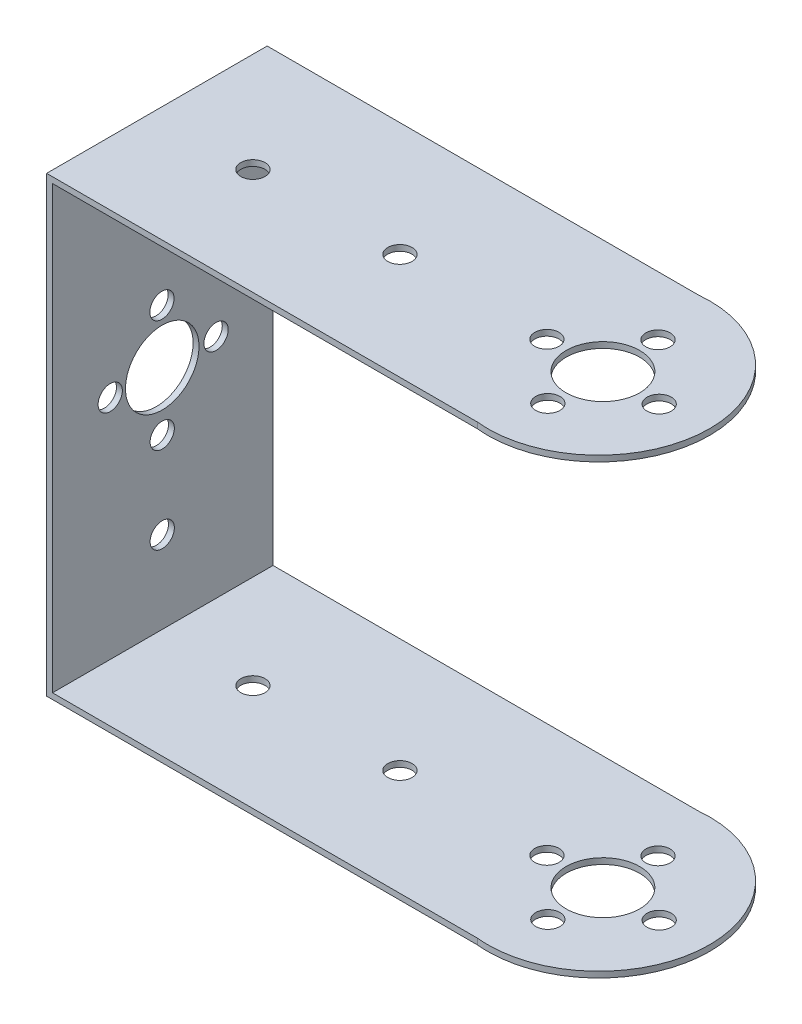
ISO-10303-21;
HEADER;
FILE_DESCRIPTION(('STEP AP214'),'2;1');
FILE_NAME('part.step','',(''),(''),'','','');
FILE_SCHEMA(('AUTOMOTIVE_DESIGN { 1 0 10303 214 1 1 1 1 }'));
ENDSEC;
DATA;
#1=APPLICATION_CONTEXT('core data for automotive mechanical design processes');
#2=APPLICATION_PROTOCOL_DEFINITION('international standard','automotive_design',2000,#1);
#3=PRODUCT_CONTEXT('',#1,'mechanical');
#4=PRODUCT('Part','Part','',(#3));
#5=PRODUCT_RELATED_PRODUCT_CATEGORY('part','',(#4));
#6=PRODUCT_DEFINITION_FORMATION('','',#4);
#7=PRODUCT_DEFINITION_CONTEXT('part definition',#1,'design');
#8=PRODUCT_DEFINITION('design','',#6,#7);
#9=PRODUCT_DEFINITION_SHAPE('','',#8);
#10=(LENGTH_UNIT() NAMED_UNIT(*) SI_UNIT(.MILLI.,.METRE.));
#11=(NAMED_UNIT(*) PLANE_ANGLE_UNIT() SI_UNIT($,.RADIAN.));
#12=(NAMED_UNIT(*) SI_UNIT($,.STERADIAN.) SOLID_ANGLE_UNIT());
#13=UNCERTAINTY_MEASURE_WITH_UNIT(LENGTH_MEASURE(1.E-05),#10,'distance_accuracy_value','');
#14=(GEOMETRIC_REPRESENTATION_CONTEXT(3) GLOBAL_UNCERTAINTY_ASSIGNED_CONTEXT((#13)) GLOBAL_UNIT_ASSIGNED_CONTEXT((#10,
#11,#12)) REPRESENTATION_CONTEXT('',''));
#15=CARTESIAN_POINT('',(0.,0.,0.));
#16=DIRECTION('',(0.,0.,1.));
#17=DIRECTION('',(1.,0.,0.));
#18=AXIS2_PLACEMENT_3D('',#15,#16,#17);
#19=CARTESIAN_POINT('',(0.,0.,0.));
#20=DIRECTION('',(0.,1.,0.));
#21=DIRECTION('',(0.,0.,1.));
#22=AXIS2_PLACEMENT_3D('',#19,#20,#21);
#23=PLANE('',#22);
#24=CARTESIAN_POINT('',(-25.9201944732818,0.,19.3373056041218));
#25=DIRECTION('',(0.,-1.,0.));
#26=DIRECTION('',(0.,0.,-1.));
#27=AXIS2_PLACEMENT_3D('',#24,#25,#26);
#28=CIRCLE('',#27,1.65);
#29=CARTESIAN_POINT('',(-25.9201944732818,0.,17.6873056041218));
#30=VERTEX_POINT('',#29);
#31=EDGE_CURVE('E145',#30,#30,#28,.T.);
#32=ORIENTED_EDGE('',*,*,#31,.F.);
#33=EDGE_LOOP('',(#32));
#34=FACE_BOUND('',#33,.T.);
#35=CARTESIAN_POINT('',(-5.92019447328184,0.,19.3373056041218));
#36=DIRECTION('',(0.,-1.,0.));
#37=DIRECTION('',(0.,0.,-1.));
#38=AXIS2_PLACEMENT_3D('',#35,#36,#37);
#39=CIRCLE('',#38,1.65);
#40=CARTESIAN_POINT('',(-5.92019447328184,0.,17.6873056041218));
#41=VERTEX_POINT('',#40);
#42=EDGE_CURVE('E151',#41,#41,#39,.T.);
#43=ORIENTED_EDGE('',*,*,#42,.F.);
#44=EDGE_LOOP('',(#43));
#45=FACE_BOUND('',#44,.T.);
#46=CARTESIAN_POINT('',(21.6943406418652,0.,26.8270363762988));
#47=DIRECTION('',(0.,-1.,0.));
#48=DIRECTION('',(0.,0.,-1.));
#49=AXIS2_PLACEMENT_3D('',#46,#47,#48);
#50=CIRCLE('',#49,1.65);
#51=CARTESIAN_POINT('',(21.6943406418652,0.,25.1770363762988));
#52=VERTEX_POINT('',#51);
#53=EDGE_CURVE('E204',#52,#52,#50,.T.);
#54=ORIENTED_EDGE('',*,*,#53,.F.);
#55=EDGE_LOOP('',(#54));
#56=FACE_BOUND('',#55,.T.);
#57=CARTESIAN_POINT('',(29.3496448643991,0.,19.3373056041218));
#58=DIRECTION('',(0.,-1.,0.));
#59=DIRECTION('',(0.,0.,-1.));
#60=AXIS2_PLACEMENT_3D('',#57,#58,#59);
#61=CIRCLE('',#60,1.65);
#62=CARTESIAN_POINT('',(29.3496448643991,0.,17.6873056041218));
#63=VERTEX_POINT('',#62);
#64=EDGE_CURVE('E200',#63,#63,#61,.T.);
#65=ORIENTED_EDGE('',*,*,#64,.F.);
#66=EDGE_LOOP('',(#65));
#67=FACE_BOUND('',#66,.T.);
#68=CARTESIAN_POINT('',(21.6943406418652,0.,11.8412506024772));
#69=DIRECTION('',(0.,-1.,0.));
#70=DIRECTION('',(0.,0.,-1.));
#71=AXIS2_PLACEMENT_3D('',#68,#69,#70);
#72=CIRCLE('',#71,1.65);
#73=CARTESIAN_POINT('',(21.6943406418652,0.,10.1912506024772));
#74=VERTEX_POINT('',#73);
#75=EDGE_CURVE('E196',#74,#74,#72,.T.);
#76=ORIENTED_EDGE('',*,*,#75,.F.);
#77=EDGE_LOOP('',(#76));
#78=FACE_BOUND('',#77,.T.);
#79=CARTESIAN_POINT('',(14.0798055267182,0.,19.3373056041218));
#80=DIRECTION('',(0.,-1.,0.));
#81=DIRECTION('',(0.,0.,-1.));
#82=AXIS2_PLACEMENT_3D('',#79,#80,#81);
#83=CIRCLE('',#82,1.65);
#84=CARTESIAN_POINT('',(14.0798055267182,0.,17.6873056041218));
#85=VERTEX_POINT('',#84);
#86=EDGE_CURVE('E194',#85,#85,#83,.T.);
#87=ORIENTED_EDGE('',*,*,#86,.F.);
#88=EDGE_LOOP('',(#87));
#89=FACE_BOUND('',#88,.T.);
#90=CARTESIAN_POINT('',(21.6943406418652,0.,19.3373056041218));
#91=DIRECTION('',(0.,-1.,0.));
#92=DIRECTION('',(0.,0.,-1.));
#93=AXIS2_PLACEMENT_3D('',#90,#91,#92);
#94=CIRCLE('',#93,5.);
#95=CARTESIAN_POINT('',(21.6943406418652,0.,14.3373056041218));
#96=VERTEX_POINT('',#95);
#97=EDGE_CURVE('E208',#96,#96,#94,.T.);
#98=ORIENTED_EDGE('',*,*,#97,.F.);
#99=EDGE_LOOP('',(#98));
#100=FACE_BOUND('',#99,.T.);
#101=CARTESIAN_POINT('',(20.627248493928,0.,18.8118811881188));
#102=DIRECTION('',(0.,-1.,0.));
#103=DIRECTION('',(-0.284278109971945,0.,0.958741861081897));
#104=AXIS2_PLACEMENT_3D('',#101,#102,#103);
#105=ELLIPSE('',#104,15.0767433552106,15.0457340746877);
#106=CARTESIAN_POINT('',(19.1524083138284,0.,3.8118811881188));
#107=VERTEX_POINT('',#106);
#108=CARTESIAN_POINT('',(19.1187975868692,0.,33.8118811881188));
#109=VERTEX_POINT('',#108);
#110=EDGE_CURVE('E221',#107,#109,#105,.T.);
#111=ORIENTED_EDGE('',*,*,#110,.T.);
#112=DIRECTION('',(1.,0.,0.));
#113=VECTOR('',#112,1.);
#114=CARTESIAN_POINT('',(-39.5049504950495,0.,33.8118811881188));
#115=LINE('',#114,#113);
#116=CARTESIAN_POINT('',(-38.7049504950495,0.,33.8118811881188));
#117=VERTEX_POINT('',#116);
#118=EDGE_CURVE('E254',#117,#109,#115,.T.);
#119=ORIENTED_EDGE('',*,*,#118,.F.);
#120=DIRECTION('',(0.,0.,1.));
#121=VECTOR('',#120,1.);
#122=CARTESIAN_POINT('',(-38.7049504950495,0.,33.8118811881188));
#123=LINE('',#122,#121);
#124=CARTESIAN_POINT('',(-38.7049504950495,0.,3.8118811881188));
#125=VERTEX_POINT('',#124);
#126=EDGE_CURVE('E307',#125,#117,#123,.T.);
#127=ORIENTED_EDGE('',*,*,#126,.F.);
#128=DIRECTION('',(-1.,0.,0.));
#129=VECTOR('',#128,1.);
#130=CARTESIAN_POINT('',(-39.5049504950495,0.,3.8118811881188));
#131=LINE('',#130,#129);
#132=EDGE_CURVE('E67',#107,#125,#131,.T.);
#133=ORIENTED_EDGE('',*,*,#132,.F.);
#134=EDGE_LOOP('',(#111,#119,#127,#133));
#135=FACE_BOUND('',#134,.T.);
#136=ADVANCED_FACE('F49',(#34,#45,#56,#67,#78,#89,#100,#135),#23,.F.);
#137=CARTESIAN_POINT('',(-39.5049504950495,0.8,3.8118811881188));
#138=DIRECTION('',(1.,0.,0.));
#139=DIRECTION('',(0.,0.,-1.));
#140=AXIS2_PLACEMENT_3D('',#137,#138,#139);
#141=PLANE('',#140);
#142=CARTESIAN_POINT('',(-39.5049504950495,-29.1457274975182,25.9622161746225));
#143=DIRECTION('',(1.,0.,0.));
#144=DIRECTION('',(0.,0.,-1.));
#145=AXIS2_PLACEMENT_3D('',#142,#143,#144);
#146=CIRCLE('',#145,1.65);
#147=CARTESIAN_POINT('',(-39.5049504950495,-29.1457274975182,24.3122161746225));
#148=VERTEX_POINT('',#147);
#149=EDGE_CURVE('E622',#148,#148,#146,.T.);
#150=ORIENTED_EDGE('',*,*,#149,.T.);
#151=EDGE_LOOP('',(#150));
#152=FACE_BOUND('',#151,.T.);
#153=CARTESIAN_POINT('',(-39.5049504950495,-37.0989935757948,18.886165753552));
#154=DIRECTION('',(1.,0.,0.));
#155=DIRECTION('',(0.,0.,-1.));
#156=AXIS2_PLACEMENT_3D('',#153,#154,#155);
#157=CIRCLE('',#156,1.65);
#158=CARTESIAN_POINT('',(-39.5049504950495,-37.0989935757948,17.236165753552));
#159=VERTEX_POINT('',#158);
#160=EDGE_CURVE('E625',#159,#159,#157,.T.);
#161=ORIENTED_EDGE('',*,*,#160,.T.);
#162=EDGE_LOOP('',(#161));
#163=FACE_BOUND('',#162,.T.);
#164=CARTESIAN_POINT('',(-39.5049504950495,-29.1457274975182,11.5681840273893));
#165=DIRECTION('',(1.,0.,0.));
#166=DIRECTION('',(0.,0.,-1.));
#167=AXIS2_PLACEMENT_3D('',#164,#165,#166);
#168=CIRCLE('',#167,1.65);
#169=CARTESIAN_POINT('',(-39.5049504950495,-29.1457274975182,9.91818402738931));
#170=VERTEX_POINT('',#169);
#171=EDGE_CURVE('E633',#170,#170,#168,.T.);
#172=ORIENTED_EDGE('',*,*,#171,.T.);
#173=EDGE_LOOP('',(#172));
#174=FACE_BOUND('',#173,.T.);
#175=CARTESIAN_POINT('',(-39.5049504950495,-21.7860743687527,18.928301582376));
#176=DIRECTION('',(1.,0.,0.));
#177=DIRECTION('',(0.,0.,-1.));
#178=AXIS2_PLACEMENT_3D('',#175,#176,#177);
#179=CIRCLE('',#178,1.65);
#180=CARTESIAN_POINT('',(-39.5049504950495,-21.7860743687527,17.278301582376));
#181=VERTEX_POINT('',#180);
#182=EDGE_CURVE('E680',#181,#181,#179,.T.);
#183=ORIENTED_EDGE('',*,*,#182,.T.);
#184=EDGE_LOOP('',(#183));
#185=FACE_BOUND('',#184,.T.);
#186=CARTESIAN_POINT('',(-39.5049504950495,-48.8351702715342,18.886165753552));
#187=DIRECTION('',(1.,0.,0.));
#188=DIRECTION('',(0.,0.,-1.));
#189=AXIS2_PLACEMENT_3D('',#186,#187,#188);
#190=CIRCLE('',#189,1.65);
#191=CARTESIAN_POINT('',(-39.5049504950495,-48.8351702715342,17.236165753552));
#192=VERTEX_POINT('',#191);
#193=EDGE_CURVE('E684',#192,#192,#190,.T.);
#194=ORIENTED_EDGE('',*,*,#193,.T.);
#195=EDGE_LOOP('',(#194));
#196=FACE_BOUND('',#195,.T.);
#197=CARTESIAN_POINT('',(-39.5049504950495,-8.67040278265563,18.928301582376));
#198=DIRECTION('',(1.,0.,0.));
#199=DIRECTION('',(0.,0.,-1.));
#200=AXIS2_PLACEMENT_3D('',#197,#198,#199);
#201=CIRCLE('',#200,1.65);
#202=CARTESIAN_POINT('',(-39.5049504950495,-8.67040278265563,17.278301582376));
#203=VERTEX_POINT('',#202);
#204=EDGE_CURVE('E688',#203,#203,#201,.T.);
#205=ORIENTED_EDGE('',*,*,#204,.T.);
#206=EDGE_LOOP('',(#205));
#207=FACE_BOUND('',#206,.T.);
#208=CARTESIAN_POINT('',(-39.5049504950495,-29.1457274975182,18.886165753552));
#209=DIRECTION('',(1.,0.,0.));
#210=DIRECTION('',(0.,0.,-1.));
#211=AXIS2_PLACEMENT_3D('',#208,#209,#210);
#212=CIRCLE('',#211,5.);
#213=CARTESIAN_POINT('',(-39.5049504950495,-29.1457274975182,13.886165753552));
#214=VERTEX_POINT('',#213);
#215=EDGE_CURVE('E692',#214,#214,#212,.T.);
#216=ORIENTED_EDGE('',*,*,#215,.T.);
#217=EDGE_LOOP('',(#216));
#218=FACE_BOUND('',#217,.T.);
#219=DIRECTION('',(0.,-1.,0.));
#220=VECTOR('',#219,1.);
#221=CARTESIAN_POINT('',(-39.5049504950495,0.8,3.8118811881188));
#222=LINE('',#221,#220);
#223=CARTESIAN_POINT('',(-39.5049504950495,0.8,3.8118811881188));
#224=VERTEX_POINT('',#223);
#225=CARTESIAN_POINT('',(-39.5049504950495,-60.8,3.8118811881188));
#226=VERTEX_POINT('',#225);
#227=EDGE_CURVE('E59',#224,#226,#222,.T.);
#228=ORIENTED_EDGE('',*,*,#227,.T.);
#229=DIRECTION('',(0.,0.,1.));
#230=VECTOR('',#229,1.);
#231=CARTESIAN_POINT('',(-39.5049504950495,-60.8,3.8118811881188));
#232=LINE('',#231,#230);
#233=CARTESIAN_POINT('',(-39.5049504950495,-60.8,33.8118811881188));
#234=VERTEX_POINT('',#233);
#235=EDGE_CURVE('E143',#226,#234,#232,.T.);
#236=ORIENTED_EDGE('',*,*,#235,.T.);
#237=DIRECTION('',(0.,-1.,0.));
#238=VECTOR('',#237,1.);
#239=CARTESIAN_POINT('',(-39.5049504950495,0.8,33.8118811881188));
#240=LINE('',#239,#238);
#241=CARTESIAN_POINT('',(-39.5049504950495,0.8,33.8118811881188));
#242=VERTEX_POINT('',#241);
#243=EDGE_CURVE('E11',#242,#234,#240,.T.);
#244=ORIENTED_EDGE('',*,*,#243,.F.);
#245=DIRECTION('',(0.,0.,1.));
#246=VECTOR('',#245,1.);
#247=CARTESIAN_POINT('',(-39.5049504950495,0.8,3.8118811881188));
#248=LINE('',#247,#246);
#249=EDGE_CURVE('E267',#224,#242,#248,.T.);
#250=ORIENTED_EDGE('',*,*,#249,.F.);
#251=EDGE_LOOP('',(#228,#236,#244,#250));
#252=FACE_BOUND('',#251,.T.);
#253=ADVANCED_FACE('F51',(#152,#163,#174,#185,#196,#207,#218,#252),#141,.F.);
#254=CARTESIAN_POINT('',(-39.5049504950495,0.8,33.8118811881188));
#255=DIRECTION('',(0.,0.,-1.));
#256=DIRECTION('',(-1.,0.,0.));
#257=AXIS2_PLACEMENT_3D('',#254,#255,#256);
#258=PLANE('',#257);
#259=ORIENTED_EDGE('',*,*,#118,.T.);
#260=DIRECTION('',(0.,-1.,0.));
#261=VECTOR('',#260,1.);
#262=CARTESIAN_POINT('',(19.1187975868692,0.8,33.8118811881188));
#263=LINE('',#262,#261);
#264=CARTESIAN_POINT('',(19.1187975868692,0.8,33.8118811881188));
#265=VERTEX_POINT('',#264);
#266=EDGE_CURVE('E255',#265,#109,#263,.T.);
#267=ORIENTED_EDGE('',*,*,#266,.F.);
#268=DIRECTION('',(1.,0.,0.));
#269=VECTOR('',#268,1.);
#270=CARTESIAN_POINT('',(-39.5049504950495,0.8,33.8118811881188));
#271=LINE('',#270,#269);
#272=EDGE_CURVE('E314',#242,#265,#271,.T.);
#273=ORIENTED_EDGE('',*,*,#272,.F.);
#274=ORIENTED_EDGE('',*,*,#243,.T.);
#275=DIRECTION('',(1.,0.,0.));
#276=VECTOR('',#275,1.);
#277=CARTESIAN_POINT('',(-39.5049504950495,-60.8,33.8118811881188));
#278=LINE('',#277,#276);
#279=CARTESIAN_POINT('',(19.1187975868692,-60.8,33.8118811881188));
#280=VERTEX_POINT('',#279);
#281=EDGE_CURVE('E146',#234,#280,#278,.T.);
#282=ORIENTED_EDGE('',*,*,#281,.T.);
#283=DIRECTION('',(0.,1.,0.));
#284=VECTOR('',#283,1.);
#285=CARTESIAN_POINT('',(19.1187975868692,-60.8,33.8118811881188));
#286=LINE('',#285,#284);
#287=CARTESIAN_POINT('',(19.1187975868692,-60.,33.8118811881188));
#288=VERTEX_POINT('',#287);
#289=EDGE_CURVE('E124',#280,#288,#286,.T.);
#290=ORIENTED_EDGE('',*,*,#289,.T.);
#291=DIRECTION('',(1.,0.,0.));
#292=VECTOR('',#291,1.);
#293=CARTESIAN_POINT('',(-39.5049504950495,-60.,33.8118811881188));
#294=LINE('',#293,#292);
#295=CARTESIAN_POINT('',(-38.7049504950495,-60.,33.8118811881188));
#296=VERTEX_POINT('',#295);
#297=EDGE_CURVE('E156',#296,#288,#294,.T.);
#298=ORIENTED_EDGE('',*,*,#297,.F.);
#299=DIRECTION('',(0.,1.,0.));
#300=VECTOR('',#299,1.);
#301=CARTESIAN_POINT('',(-38.7049504950495,-30.,33.8118811881188));
#302=LINE('',#301,#300);
#303=EDGE_CURVE('E258',#296,#117,#302,.T.);
#304=ORIENTED_EDGE('',*,*,#303,.T.);
#305=EDGE_LOOP('',(#259,#267,#273,#274,#282,#290,#298,#304));
#306=FACE_BOUND('',#305,.T.);
#307=ADVANCED_FACE('F243',(#306),#258,.F.);
#308=CARTESIAN_POINT('',(-39.5049504950495,0.8,3.8118811881188));
#309=DIRECTION('',(0.,0.,1.));
#310=DIRECTION('',(1.,0.,0.));
#311=AXIS2_PLACEMENT_3D('',#308,#309,#310);
#312=PLANE('',#311);
#313=DIRECTION('',(-1.,0.,0.));
#314=VECTOR('',#313,1.);
#315=CARTESIAN_POINT('',(-39.5049504950495,0.8,3.8118811881188));
#316=LINE('',#315,#314);
#317=CARTESIAN_POINT('',(19.1524083138284,0.8,3.8118811881188));
#318=VERTEX_POINT('',#317);
#319=EDGE_CURVE('E75',#318,#224,#316,.T.);
#320=ORIENTED_EDGE('',*,*,#319,.F.);
#321=DIRECTION('',(0.,-1.,0.));
#322=VECTOR('',#321,1.);
#323=CARTESIAN_POINT('',(19.1524083138284,0.8,3.8118811881188));
#324=LINE('',#323,#322);
#325=EDGE_CURVE('E220',#318,#107,#324,.T.);
#326=ORIENTED_EDGE('',*,*,#325,.T.);
#327=ORIENTED_EDGE('',*,*,#132,.T.);
#328=DIRECTION('',(0.,1.,0.));
#329=VECTOR('',#328,1.);
#330=CARTESIAN_POINT('',(-38.7049504950495,-30.,3.8118811881188));
#331=LINE('',#330,#329);
#332=CARTESIAN_POINT('',(-38.7049504950495,-60.,3.8118811881188));
#333=VERTEX_POINT('',#332);
#334=EDGE_CURVE('E263',#333,#125,#331,.T.);
#335=ORIENTED_EDGE('',*,*,#334,.F.);
#336=DIRECTION('',(-1.,0.,0.));
#337=VECTOR('',#336,1.);
#338=CARTESIAN_POINT('',(-39.5049504950495,-60.,3.8118811881188));
#339=LINE('',#338,#337);
#340=CARTESIAN_POINT('',(19.1524083138284,-60.,3.8118811881188));
#341=VERTEX_POINT('',#340);
#342=EDGE_CURVE('E137',#341,#333,#339,.T.);
#343=ORIENTED_EDGE('',*,*,#342,.F.);
#344=DIRECTION('',(0.,1.,0.));
#345=VECTOR('',#344,1.);
#346=CARTESIAN_POINT('',(19.1524083138284,-60.8,3.8118811881188));
#347=LINE('',#346,#345);
#348=CARTESIAN_POINT('',(19.1524083138284,-60.8,3.8118811881188));
#349=VERTEX_POINT('',#348);
#350=EDGE_CURVE('E122',#349,#341,#347,.T.);
#351=ORIENTED_EDGE('',*,*,#350,.F.);
#352=DIRECTION('',(-1.,0.,0.));
#353=VECTOR('',#352,1.);
#354=CARTESIAN_POINT('',(-39.5049504950495,-60.8,3.8118811881188));
#355=LINE('',#354,#353);
#356=EDGE_CURVE('E134',#349,#226,#355,.T.);
#357=ORIENTED_EDGE('',*,*,#356,.T.);
#358=ORIENTED_EDGE('',*,*,#227,.F.);
#359=EDGE_LOOP('',(#320,#326,#327,#335,#343,#351,#357,#358));
#360=FACE_BOUND('',#359,.T.);
#361=ADVANCED_FACE('F133',(#360),#312,.F.);
#362=CARTESIAN_POINT('',(0.,0.8,0.));
#363=DIRECTION('',(0.,1.,0.));
#364=DIRECTION('',(0.,0.,1.));
#365=AXIS2_PLACEMENT_3D('',#362,#363,#364);
#366=PLANE('',#365);
#367=CARTESIAN_POINT('',(-25.9201944732818,0.8,19.3373056041218));
#368=DIRECTION('',(0.,1.,0.));
#369=DIRECTION('',(0.,0.,1.));
#370=AXIS2_PLACEMENT_3D('',#367,#368,#369);
#371=CIRCLE('',#370,1.65);
#372=CARTESIAN_POINT('',(-25.9201944732818,0.8,20.9873056041219));
#373=VERTEX_POINT('',#372);
#374=EDGE_CURVE('E53',#373,#373,#371,.T.);
#375=ORIENTED_EDGE('',*,*,#374,.F.);
#376=EDGE_LOOP('',(#375));
#377=FACE_BOUND('',#376,.T.);
#378=CARTESIAN_POINT('',(-5.92019447328184,0.8,19.3373056041218));
#379=DIRECTION('',(0.,1.,0.));
#380=DIRECTION('',(0.,0.,1.));
#381=AXIS2_PLACEMENT_3D('',#378,#379,#380);
#382=CIRCLE('',#381,1.65);
#383=CARTESIAN_POINT('',(-5.92019447328184,0.8,20.9873056041218));
#384=VERTEX_POINT('',#383);
#385=EDGE_CURVE('E294',#384,#384,#382,.T.);
#386=ORIENTED_EDGE('',*,*,#385,.F.);
#387=EDGE_LOOP('',(#386));
#388=FACE_BOUND('',#387,.T.);
#389=CARTESIAN_POINT('',(21.6943406418652,0.8,26.8270363762988));
#390=DIRECTION('',(0.,1.,0.));
#391=DIRECTION('',(0.,0.,1.));
#392=AXIS2_PLACEMENT_3D('',#389,#390,#391);
#393=CIRCLE('',#392,1.65);
#394=CARTESIAN_POINT('',(21.6943406418652,0.8,28.4770363762988));
#395=VERTEX_POINT('',#394);
#396=EDGE_CURVE('E291',#395,#395,#393,.T.);
#397=ORIENTED_EDGE('',*,*,#396,.F.);
#398=EDGE_LOOP('',(#397));
#399=FACE_BOUND('',#398,.T.);
#400=CARTESIAN_POINT('',(29.3496448643991,0.8,19.3373056041218));
#401=DIRECTION('',(0.,1.,0.));
#402=DIRECTION('',(0.,0.,1.));
#403=AXIS2_PLACEMENT_3D('',#400,#401,#402);
#404=CIRCLE('',#403,1.65);
#405=CARTESIAN_POINT('',(29.3496448643991,0.8,20.9873056041218));
#406=VERTEX_POINT('',#405);
#407=EDGE_CURVE('E287',#406,#406,#404,.T.);
#408=ORIENTED_EDGE('',*,*,#407,.F.);
#409=EDGE_LOOP('',(#408));
#410=FACE_BOUND('',#409,.T.);
#411=CARTESIAN_POINT('',(21.6943406418652,0.8,11.8412506024772));
#412=DIRECTION('',(0.,1.,0.));
#413=DIRECTION('',(0.,0.,1.));
#414=AXIS2_PLACEMENT_3D('',#411,#412,#413);
#415=CIRCLE('',#414,1.65);
#416=CARTESIAN_POINT('',(21.6943406418652,0.8,13.4912506024772));
#417=VERTEX_POINT('',#416);
#418=EDGE_CURVE('E283',#417,#417,#415,.T.);
#419=ORIENTED_EDGE('',*,*,#418,.F.);
#420=EDGE_LOOP('',(#419));
#421=FACE_BOUND('',#420,.T.);
#422=CARTESIAN_POINT('',(14.0798055267182,0.8,19.3373056041218));
#423=DIRECTION('',(0.,1.,0.));
#424=DIRECTION('',(0.,0.,1.));
#425=AXIS2_PLACEMENT_3D('',#422,#423,#424);
#426=CIRCLE('',#425,1.65);
#427=CARTESIAN_POINT('',(14.0798055267182,0.8,20.9873056041218));
#428=VERTEX_POINT('',#427);
#429=EDGE_CURVE('E279',#428,#428,#426,.T.);
#430=ORIENTED_EDGE('',*,*,#429,.F.);
#431=EDGE_LOOP('',(#430));
#432=FACE_BOUND('',#431,.T.);
#433=CARTESIAN_POINT('',(21.6943406418652,0.8,19.3373056041218));
#434=DIRECTION('',(0.,1.,0.));
#435=DIRECTION('',(0.,0.,1.));
#436=AXIS2_PLACEMENT_3D('',#433,#434,#435);
#437=CIRCLE('',#436,5.);
#438=CARTESIAN_POINT('',(21.6943406418652,0.8,24.3373056041218));
#439=VERTEX_POINT('',#438);
#440=EDGE_CURVE('E215',#439,#439,#437,.T.);
#441=ORIENTED_EDGE('',*,*,#440,.F.);
#442=EDGE_LOOP('',(#441));
#443=FACE_BOUND('',#442,.T.);
#444=CARTESIAN_POINT('',(20.627248493928,0.8,18.8118811881188));
#445=DIRECTION('',(0.,-1.,0.));
#446=DIRECTION('',(-0.284278109971945,0.,0.958741861081897));
#447=AXIS2_PLACEMENT_3D('',#444,#445,#446);
#448=ELLIPSE('',#447,15.0767433552106,15.0457340746877);
#449=EDGE_CURVE('E216',#318,#265,#448,.T.);
#450=ORIENTED_EDGE('',*,*,#449,.F.);
#451=ORIENTED_EDGE('',*,*,#319,.T.);
#452=ORIENTED_EDGE('',*,*,#249,.T.);
#453=ORIENTED_EDGE('',*,*,#272,.T.);
#454=EDGE_LOOP('',(#450,#451,#452,#453));
#455=FACE_BOUND('',#454,.T.);
#456=ADVANCED_FACE('F234',(#377,#388,#399,#410,#421,#432,#443,#455),#366,.T.);
#457=CARTESIAN_POINT('',(-38.7049504950495,-30.,33.8118811881188));
#458=DIRECTION('',(-1.,0.,0.));
#459=DIRECTION('',(0.,0.,1.));
#460=AXIS2_PLACEMENT_3D('',#457,#458,#459);
#461=PLANE('',#460);
#462=CARTESIAN_POINT('',(-38.7049504950495,-29.1457274975182,25.9622161746225));
#463=DIRECTION('',(1.,0.,0.));
#464=DIRECTION('',(0.,0.,-1.));
#465=AXIS2_PLACEMENT_3D('',#462,#463,#464);
#466=CIRCLE('',#465,1.65);
#467=CARTESIAN_POINT('',(-38.7049504950495,-29.1457274975182,24.3122161746225));
#468=VERTEX_POINT('',#467);
#469=EDGE_CURVE('E619',#468,#468,#466,.T.);
#470=ORIENTED_EDGE('',*,*,#469,.F.);
#471=EDGE_LOOP('',(#470));
#472=FACE_BOUND('',#471,.T.);
#473=CARTESIAN_POINT('',(-38.7049504950495,-37.0989935757948,18.886165753552));
#474=DIRECTION('',(1.,0.,0.));
#475=DIRECTION('',(0.,0.,-1.));
#476=AXIS2_PLACEMENT_3D('',#473,#474,#475);
#477=CIRCLE('',#476,1.65);
#478=CARTESIAN_POINT('',(-38.7049504950495,-37.0989935757948,17.236165753552));
#479=VERTEX_POINT('',#478);
#480=EDGE_CURVE('E705',#479,#479,#477,.T.);
#481=ORIENTED_EDGE('',*,*,#480,.F.);
#482=EDGE_LOOP('',(#481));
#483=FACE_BOUND('',#482,.T.);
#484=CARTESIAN_POINT('',(-38.7049504950495,-29.1457274975182,11.5681840273893));
#485=DIRECTION('',(1.,0.,0.));
#486=DIRECTION('',(0.,0.,-1.));
#487=AXIS2_PLACEMENT_3D('',#484,#485,#486);
#488=CIRCLE('',#487,1.65);
#489=CARTESIAN_POINT('',(-38.7049504950495,-29.1457274975182,9.91818402738931));
#490=VERTEX_POINT('',#489);
#491=EDGE_CURVE('E701',#490,#490,#488,.T.);
#492=ORIENTED_EDGE('',*,*,#491,.F.);
#493=EDGE_LOOP('',(#492));
#494=FACE_BOUND('',#493,.T.);
#495=CARTESIAN_POINT('',(-38.7049504950495,-21.7860743687527,18.928301582376));
#496=DIRECTION('',(1.,0.,0.));
#497=DIRECTION('',(0.,0.,-1.));
#498=AXIS2_PLACEMENT_3D('',#495,#496,#497);
#499=CIRCLE('',#498,1.65);
#500=CARTESIAN_POINT('',(-38.7049504950495,-21.7860743687527,17.278301582376));
#501=VERTEX_POINT('',#500);
#502=EDGE_CURVE('E700',#501,#501,#499,.T.);
#503=ORIENTED_EDGE('',*,*,#502,.F.);
#504=EDGE_LOOP('',(#503));
#505=FACE_BOUND('',#504,.T.);
#506=CARTESIAN_POINT('',(-38.7049504950495,-48.8351702715342,18.886165753552));
#507=DIRECTION('',(1.,0.,0.));
#508=DIRECTION('',(0.,0.,-1.));
#509=AXIS2_PLACEMENT_3D('',#506,#507,#508);
#510=CIRCLE('',#509,1.65);
#511=CARTESIAN_POINT('',(-38.7049504950495,-48.8351702715342,17.236165753552));
#512=VERTEX_POINT('',#511);
#513=EDGE_CURVE('E711',#512,#512,#510,.T.);
#514=ORIENTED_EDGE('',*,*,#513,.F.);
#515=EDGE_LOOP('',(#514));
#516=FACE_BOUND('',#515,.T.);
#517=CARTESIAN_POINT('',(-38.7049504950495,-8.67040278265563,18.928301582376));
#518=DIRECTION('',(1.,0.,0.));
#519=DIRECTION('',(0.,0.,-1.));
#520=AXIS2_PLACEMENT_3D('',#517,#518,#519);
#521=CIRCLE('',#520,1.65);
#522=CARTESIAN_POINT('',(-38.7049504950495,-8.67040278265563,17.278301582376));
#523=VERTEX_POINT('',#522);
#524=EDGE_CURVE('E715',#523,#523,#521,.T.);
#525=ORIENTED_EDGE('',*,*,#524,.F.);
#526=EDGE_LOOP('',(#525));
#527=FACE_BOUND('',#526,.T.);
#528=CARTESIAN_POINT('',(-38.7049504950495,-29.1457274975182,18.886165753552));
#529=DIRECTION('',(1.,0.,0.));
#530=DIRECTION('',(0.,0.,-1.));
#531=AXIS2_PLACEMENT_3D('',#528,#529,#530);
#532=CIRCLE('',#531,5.);
#533=CARTESIAN_POINT('',(-38.7049504950495,-29.1457274975182,13.886165753552));
#534=VERTEX_POINT('',#533);
#535=EDGE_CURVE('E696',#534,#534,#532,.T.);
#536=ORIENTED_EDGE('',*,*,#535,.F.);
#537=EDGE_LOOP('',(#536));
#538=FACE_BOUND('',#537,.T.);
#539=ORIENTED_EDGE('',*,*,#126,.T.);
#540=ORIENTED_EDGE('',*,*,#303,.F.);
#541=DIRECTION('',(0.,0.,1.));
#542=VECTOR('',#541,1.);
#543=CARTESIAN_POINT('',(-38.7049504950495,-60.,33.8118811881188));
#544=LINE('',#543,#542);
#545=EDGE_CURVE('E160',#333,#296,#544,.T.);
#546=ORIENTED_EDGE('',*,*,#545,.F.);
#547=ORIENTED_EDGE('',*,*,#334,.T.);
#548=EDGE_LOOP('',(#539,#540,#546,#547));
#549=FACE_BOUND('',#548,.T.);
#550=ADVANCED_FACE('F229',(#472,#483,#494,#505,#516,#527,#538,#549),#461,.F.);
#551=DIRECTION('',(0.,-1.,0.));
#552=VECTOR('',#551,1.);
#553=SURFACE_OF_LINEAR_EXTRUSION('',#448,#552);
#554=ORIENTED_EDGE('',*,*,#110,.F.);
#555=ORIENTED_EDGE('',*,*,#325,.F.);
#556=ORIENTED_EDGE('',*,*,#449,.T.);
#557=ORIENTED_EDGE('',*,*,#266,.T.);
#558=EDGE_LOOP('',(#554,#555,#556,#557));
#559=FACE_BOUND('',#558,.T.);
#560=ADVANCED_FACE('F224',(#559),#553,.T.);
#561=CARTESIAN_POINT('',(21.6943406418652,10.,19.3373056041218));
#562=DIRECTION('',(0.,-1.,0.));
#563=DIRECTION('',(0.,0.,-1.));
#564=AXIS2_PLACEMENT_3D('',#561,#562,#563);
#565=CYLINDRICAL_SURFACE('',#564,5.);
#566=ORIENTED_EDGE('',*,*,#440,.T.);
#567=EDGE_LOOP('',(#566));
#568=FACE_BOUND('',#567,.T.);
#569=ORIENTED_EDGE('',*,*,#97,.T.);
#570=EDGE_LOOP('',(#569));
#571=FACE_BOUND('',#570,.T.);
#572=ADVANCED_FACE('F228',(#568,#571),#565,.F.);
#573=CARTESIAN_POINT('',(14.0798055267182,10.,19.3373056041218));
#574=DIRECTION('',(0.,-1.,0.));
#575=DIRECTION('',(0.,0.,-1.));
#576=AXIS2_PLACEMENT_3D('',#573,#574,#575);
#577=CYLINDRICAL_SURFACE('',#576,1.65);
#578=ORIENTED_EDGE('',*,*,#429,.T.);
#579=EDGE_LOOP('',(#578));
#580=FACE_BOUND('',#579,.T.);
#581=ORIENTED_EDGE('',*,*,#86,.T.);
#582=EDGE_LOOP('',(#581));
#583=FACE_BOUND('',#582,.T.);
#584=ADVANCED_FACE('F355',(#580,#583),#577,.F.);
#585=CARTESIAN_POINT('',(21.6943406418652,10.,11.8412506024772));
#586=DIRECTION('',(0.,-1.,0.));
#587=DIRECTION('',(0.,0.,-1.));
#588=AXIS2_PLACEMENT_3D('',#585,#586,#587);
#589=CYLINDRICAL_SURFACE('',#588,1.65);
#590=ORIENTED_EDGE('',*,*,#418,.T.);
#591=EDGE_LOOP('',(#590));
#592=FACE_BOUND('',#591,.T.);
#593=ORIENTED_EDGE('',*,*,#75,.T.);
#594=EDGE_LOOP('',(#593));
#595=FACE_BOUND('',#594,.T.);
#596=ADVANCED_FACE('F351',(#592,#595),#589,.F.);
#597=CARTESIAN_POINT('',(29.3496448643991,10.,19.3373056041218));
#598=DIRECTION('',(0.,-1.,0.));
#599=DIRECTION('',(0.,0.,-1.));
#600=AXIS2_PLACEMENT_3D('',#597,#598,#599);
#601=CYLINDRICAL_SURFACE('',#600,1.65);
#602=ORIENTED_EDGE('',*,*,#407,.T.);
#603=EDGE_LOOP('',(#602));
#604=FACE_BOUND('',#603,.T.);
#605=ORIENTED_EDGE('',*,*,#64,.T.);
#606=EDGE_LOOP('',(#605));
#607=FACE_BOUND('',#606,.T.);
#608=ADVANCED_FACE('F354',(#604,#607),#601,.F.);
#609=CARTESIAN_POINT('',(21.6943406418652,10.,26.8270363762988));
#610=DIRECTION('',(0.,-1.,0.));
#611=DIRECTION('',(0.,0.,-1.));
#612=AXIS2_PLACEMENT_3D('',#609,#610,#611);
#613=CYLINDRICAL_SURFACE('',#612,1.65);
#614=ORIENTED_EDGE('',*,*,#396,.T.);
#615=EDGE_LOOP('',(#614));
#616=FACE_BOUND('',#615,.T.);
#617=ORIENTED_EDGE('',*,*,#53,.T.);
#618=EDGE_LOOP('',(#617));
#619=FACE_BOUND('',#618,.T.);
#620=ADVANCED_FACE('F348',(#616,#619),#613,.F.);
#621=CARTESIAN_POINT('',(-5.92019447328184,10.,19.3373056041218));
#622=DIRECTION('',(0.,-1.,0.));
#623=DIRECTION('',(0.,0.,-1.));
#624=AXIS2_PLACEMENT_3D('',#621,#622,#623);
#625=CYLINDRICAL_SURFACE('',#624,1.65);
#626=ORIENTED_EDGE('',*,*,#385,.T.);
#627=EDGE_LOOP('',(#626));
#628=FACE_BOUND('',#627,.T.);
#629=ORIENTED_EDGE('',*,*,#42,.T.);
#630=EDGE_LOOP('',(#629));
#631=FACE_BOUND('',#630,.T.);
#632=ADVANCED_FACE('F345',(#628,#631),#625,.F.);
#633=CARTESIAN_POINT('',(-25.9201944732818,10.,19.3373056041218));
#634=DIRECTION('',(0.,-1.,0.));
#635=DIRECTION('',(0.,0.,-1.));
#636=AXIS2_PLACEMENT_3D('',#633,#634,#635);
#637=CYLINDRICAL_SURFACE('',#636,1.65);
#638=ORIENTED_EDGE('',*,*,#374,.T.);
#639=EDGE_LOOP('',(#638));
#640=FACE_BOUND('',#639,.T.);
#641=ORIENTED_EDGE('',*,*,#31,.T.);
#642=EDGE_LOOP('',(#641));
#643=FACE_BOUND('',#642,.T.);
#644=ADVANCED_FACE('F343',(#640,#643),#637,.F.);
#645=CARTESIAN_POINT('',(0.,-60.,0.));
#646=DIRECTION('',(0.,-1.,0.));
#647=DIRECTION('',(0.,0.,1.));
#648=AXIS2_PLACEMENT_3D('',#645,#646,#647);
#649=PLANE('',#648);
#650=CARTESIAN_POINT('',(-25.9201944732818,-60.,19.3373056041218));
#651=DIRECTION('',(0.,-1.,0.));
#652=DIRECTION('',(0.,0.,-1.));
#653=AXIS2_PLACEMENT_3D('',#650,#651,#652);
#654=CIRCLE('',#653,1.65);
#655=CARTESIAN_POINT('',(-25.9201944732818,-60.,17.6873056041218));
#656=VERTEX_POINT('',#655);
#657=EDGE_CURVE('E624',#656,#656,#654,.T.);
#658=ORIENTED_EDGE('',*,*,#657,.T.);
#659=EDGE_LOOP('',(#658));
#660=FACE_BOUND('',#659,.T.);
#661=CARTESIAN_POINT('',(-5.92019447328184,-60.,19.3373056041218));
#662=DIRECTION('',(0.,-1.,0.));
#663=DIRECTION('',(0.,0.,-1.));
#664=AXIS2_PLACEMENT_3D('',#661,#662,#663);
#665=CIRCLE('',#664,1.65);
#666=CARTESIAN_POINT('',(-5.92019447328184,-60.,17.6873056041218));
#667=VERTEX_POINT('',#666);
#668=EDGE_CURVE('E630',#667,#667,#665,.T.);
#669=ORIENTED_EDGE('',*,*,#668,.T.);
#670=EDGE_LOOP('',(#669));
#671=FACE_BOUND('',#670,.T.);
#672=CARTESIAN_POINT('',(21.6943406418652,-60.,26.8270363762988));
#673=DIRECTION('',(0.,-1.,0.));
#674=DIRECTION('',(0.,0.,-1.));
#675=AXIS2_PLACEMENT_3D('',#672,#673,#674);
#676=CIRCLE('',#675,1.65);
#677=CARTESIAN_POINT('',(21.6943406418652,-60.,25.1770363762988));
#678=VERTEX_POINT('',#677);
#679=EDGE_CURVE('E649',#678,#678,#676,.T.);
#680=ORIENTED_EDGE('',*,*,#679,.T.);
#681=EDGE_LOOP('',(#680));
#682=FACE_BOUND('',#681,.T.);
#683=CARTESIAN_POINT('',(29.3496448643991,-60.,19.3373056041218));
#684=DIRECTION('',(0.,-1.,0.));
#685=DIRECTION('',(0.,0.,-1.));
#686=AXIS2_PLACEMENT_3D('',#683,#684,#685);
#687=CIRCLE('',#686,1.65);
#688=CARTESIAN_POINT('',(29.3496448643991,-60.,17.6873056041218));
#689=VERTEX_POINT('',#688);
#690=EDGE_CURVE('E645',#689,#689,#687,.T.);
#691=ORIENTED_EDGE('',*,*,#690,.T.);
#692=EDGE_LOOP('',(#691));
#693=FACE_BOUND('',#692,.T.);
#694=CARTESIAN_POINT('',(21.6943406418652,-60.,11.8412506024772));
#695=DIRECTION('',(0.,-1.,0.));
#696=DIRECTION('',(0.,0.,-1.));
#697=AXIS2_PLACEMENT_3D('',#694,#695,#696);
#698=CIRCLE('',#697,1.65);
#699=CARTESIAN_POINT('',(21.6943406418652,-60.,10.1912506024772));
#700=VERTEX_POINT('',#699);
#701=EDGE_CURVE('E641',#700,#700,#698,.T.);
#702=ORIENTED_EDGE('',*,*,#701,.T.);
#703=EDGE_LOOP('',(#702));
#704=FACE_BOUND('',#703,.T.);
#705=CARTESIAN_POINT('',(14.0798055267182,-60.,19.3373056041218));
#706=DIRECTION('',(0.,-1.,0.));
#707=DIRECTION('',(0.,0.,-1.));
#708=AXIS2_PLACEMENT_3D('',#705,#706,#707);
#709=CIRCLE('',#708,1.65);
#710=CARTESIAN_POINT('',(14.0798055267182,-60.,17.6873056041218));
#711=VERTEX_POINT('',#710);
#712=EDGE_CURVE('E639',#711,#711,#709,.T.);
#713=ORIENTED_EDGE('',*,*,#712,.T.);
#714=EDGE_LOOP('',(#713));
#715=FACE_BOUND('',#714,.T.);
#716=CARTESIAN_POINT('',(21.6943406418652,-60.,19.3373056041218));
#717=DIRECTION('',(0.,-1.,0.));
#718=DIRECTION('',(0.,0.,-1.));
#719=AXIS2_PLACEMENT_3D('',#716,#717,#718);
#720=CIRCLE('',#719,5.);
#721=CARTESIAN_POINT('',(21.6943406418652,-60.,14.3373056041218));
#722=VERTEX_POINT('',#721);
#723=EDGE_CURVE('E168',#722,#722,#720,.T.);
#724=ORIENTED_EDGE('',*,*,#723,.T.);
#725=EDGE_LOOP('',(#724));
#726=FACE_BOUND('',#725,.T.);
#727=CARTESIAN_POINT('',(20.627248493928,-60.,18.8118811881188));
#728=DIRECTION('',(0.,-1.,0.));
#729=DIRECTION('',(-0.284278109971945,0.,0.958741861081897));
#730=AXIS2_PLACEMENT_3D('',#727,#728,#729);
#731=ELLIPSE('',#730,15.0767433552106,15.0457340746877);
#732=EDGE_CURVE('E130',#341,#288,#731,.T.);
#733=ORIENTED_EDGE('',*,*,#732,.F.);
#734=ORIENTED_EDGE('',*,*,#342,.T.);
#735=ORIENTED_EDGE('',*,*,#545,.T.);
#736=ORIENTED_EDGE('',*,*,#297,.T.);
#737=EDGE_LOOP('',(#733,#734,#735,#736));
#738=FACE_BOUND('',#737,.T.);
#739=ADVANCED_FACE('F339',(#660,#671,#682,#693,#704,#715,#726,#738),#649,.F.);
#740=CARTESIAN_POINT('',(0.,-60.8,0.));
#741=DIRECTION('',(0.,-1.,0.));
#742=DIRECTION('',(0.,0.,1.));
#743=AXIS2_PLACEMENT_3D('',#740,#741,#742);
#744=PLANE('',#743);
#745=CARTESIAN_POINT('',(-25.9201944732818,-60.8,19.3373056041218));
#746=DIRECTION('',(0.,1.,0.));
#747=DIRECTION('',(0.,0.,1.));
#748=AXIS2_PLACEMENT_3D('',#745,#746,#747);
#749=CIRCLE('',#748,1.65);
#750=CARTESIAN_POINT('',(-25.9201944732818,-60.8,20.9873056041219));
#751=VERTEX_POINT('',#750);
#752=EDGE_CURVE('E188',#751,#751,#749,.T.);
#753=ORIENTED_EDGE('',*,*,#752,.T.);
#754=EDGE_LOOP('',(#753));
#755=FACE_BOUND('',#754,.T.);
#756=CARTESIAN_POINT('',(-5.92019447328184,-60.8,19.3373056041218));
#757=DIRECTION('',(0.,1.,0.));
#758=DIRECTION('',(0.,0.,1.));
#759=AXIS2_PLACEMENT_3D('',#756,#757,#758);
#760=CIRCLE('',#759,1.65);
#761=CARTESIAN_POINT('',(-5.92019447328184,-60.8,20.9873056041218));
#762=VERTEX_POINT('',#761);
#763=EDGE_CURVE('E184',#762,#762,#760,.T.);
#764=ORIENTED_EDGE('',*,*,#763,.T.);
#765=EDGE_LOOP('',(#764));
#766=FACE_BOUND('',#765,.T.);
#767=CARTESIAN_POINT('',(21.6943406418652,-60.8,26.8270363762988));
#768=DIRECTION('',(0.,1.,0.));
#769=DIRECTION('',(0.,0.,1.));
#770=AXIS2_PLACEMENT_3D('',#767,#768,#769);
#771=CIRCLE('',#770,1.65);
#772=CARTESIAN_POINT('',(21.6943406418652,-60.8,28.4770363762988));
#773=VERTEX_POINT('',#772);
#774=EDGE_CURVE('E180',#773,#773,#771,.T.);
#775=ORIENTED_EDGE('',*,*,#774,.T.);
#776=EDGE_LOOP('',(#775));
#777=FACE_BOUND('',#776,.T.);
#778=CARTESIAN_POINT('',(29.3496448643991,-60.8,19.3373056041218));
#779=DIRECTION('',(0.,1.,0.));
#780=DIRECTION('',(0.,0.,1.));
#781=AXIS2_PLACEMENT_3D('',#778,#779,#780);
#782=CIRCLE('',#781,1.65);
#783=CARTESIAN_POINT('',(29.3496448643991,-60.8,20.9873056041218));
#784=VERTEX_POINT('',#783);
#785=EDGE_CURVE('E176',#784,#784,#782,.T.);
#786=ORIENTED_EDGE('',*,*,#785,.T.);
#787=EDGE_LOOP('',(#786));
#788=FACE_BOUND('',#787,.T.);
#789=CARTESIAN_POINT('',(21.6943406418652,-60.8,11.8412506024772));
#790=DIRECTION('',(0.,1.,0.));
#791=DIRECTION('',(0.,0.,1.));
#792=AXIS2_PLACEMENT_3D('',#789,#790,#791);
#793=CIRCLE('',#792,1.65);
#794=CARTESIAN_POINT('',(21.6943406418652,-60.8,13.4912506024772));
#795=VERTEX_POINT('',#794);
#796=EDGE_CURVE('E172',#795,#795,#793,.T.);
#797=ORIENTED_EDGE('',*,*,#796,.T.);
#798=EDGE_LOOP('',(#797));
#799=FACE_BOUND('',#798,.T.);
#800=CARTESIAN_POINT('',(14.0798055267182,-60.8,19.3373056041218));
#801=DIRECTION('',(0.,1.,0.));
#802=DIRECTION('',(0.,0.,1.));
#803=AXIS2_PLACEMENT_3D('',#800,#801,#802);
#804=CIRCLE('',#803,1.65);
#805=CARTESIAN_POINT('',(14.0798055267182,-60.8,20.9873056041218));
#806=VERTEX_POINT('',#805);
#807=EDGE_CURVE('E167',#806,#806,#804,.T.);
#808=ORIENTED_EDGE('',*,*,#807,.T.);
#809=EDGE_LOOP('',(#808));
#810=FACE_BOUND('',#809,.T.);
#811=CARTESIAN_POINT('',(21.6943406418652,-60.8,19.3373056041218));
#812=DIRECTION('',(0.,1.,0.));
#813=DIRECTION('',(0.,0.,1.));
#814=AXIS2_PLACEMENT_3D('',#811,#812,#813);
#815=CIRCLE('',#814,5.);
#816=CARTESIAN_POINT('',(21.6943406418652,-60.8,24.3373056041218));
#817=VERTEX_POINT('',#816);
#818=EDGE_CURVE('E163',#817,#817,#815,.T.);
#819=ORIENTED_EDGE('',*,*,#818,.T.);
#820=EDGE_LOOP('',(#819));
#821=FACE_BOUND('',#820,.T.);
#822=CARTESIAN_POINT('',(20.627248493928,-60.8,18.8118811881188));
#823=DIRECTION('',(0.,-1.,0.));
#824=DIRECTION('',(-0.284278109971945,0.,0.958741861081897));
#825=AXIS2_PLACEMENT_3D('',#822,#823,#824);
#826=ELLIPSE('',#825,15.0767433552106,15.0457340746877);
#827=EDGE_CURVE('E118',#349,#280,#826,.T.);
#828=ORIENTED_EDGE('',*,*,#827,.T.);
#829=ORIENTED_EDGE('',*,*,#281,.F.);
#830=ORIENTED_EDGE('',*,*,#235,.F.);
#831=ORIENTED_EDGE('',*,*,#356,.F.);
#832=EDGE_LOOP('',(#828,#829,#830,#831));
#833=FACE_BOUND('',#832,.T.);
#834=ADVANCED_FACE('F141',(#755,#766,#777,#788,#799,#810,#821,#833),#744,.T.);
#835=DIRECTION('',(0.,1.,0.));
#836=VECTOR('',#835,1.);
#837=SURFACE_OF_LINEAR_EXTRUSION('',#826,#836);
#838=ORIENTED_EDGE('',*,*,#732,.T.);
#839=ORIENTED_EDGE('',*,*,#289,.F.);
#840=ORIENTED_EDGE('',*,*,#827,.F.);
#841=ORIENTED_EDGE('',*,*,#350,.T.);
#842=EDGE_LOOP('',(#838,#839,#840,#841));
#843=FACE_BOUND('',#842,.T.);
#844=ADVANCED_FACE('F121',(#843),#837,.F.);
#845=CARTESIAN_POINT('',(21.6943406418652,-70.,19.3373056041218));
#846=DIRECTION('',(0.,1.,0.));
#847=DIRECTION('',(0.,0.,-1.));
#848=AXIS2_PLACEMENT_3D('',#845,#846,#847);
#849=CYLINDRICAL_SURFACE('',#848,5.);
#850=ORIENTED_EDGE('',*,*,#818,.F.);
#851=EDGE_LOOP('',(#850));
#852=FACE_BOUND('',#851,.T.);
#853=ORIENTED_EDGE('',*,*,#723,.F.);
#854=EDGE_LOOP('',(#853));
#855=FACE_BOUND('',#854,.T.);
#856=ADVANCED_FACE('F335',(#852,#855),#849,.F.);
#857=CARTESIAN_POINT('',(14.0798055267182,-70.,19.3373056041218));
#858=DIRECTION('',(0.,1.,0.));
#859=DIRECTION('',(0.,0.,-1.));
#860=AXIS2_PLACEMENT_3D('',#857,#858,#859);
#861=CYLINDRICAL_SURFACE('',#860,1.65);
#862=ORIENTED_EDGE('',*,*,#807,.F.);
#863=EDGE_LOOP('',(#862));
#864=FACE_BOUND('',#863,.T.);
#865=ORIENTED_EDGE('',*,*,#712,.F.);
#866=EDGE_LOOP('',(#865));
#867=FACE_BOUND('',#866,.T.);
#868=ADVANCED_FACE('F487',(#864,#867),#861,.F.);
#869=CARTESIAN_POINT('',(21.6943406418652,-70.,11.8412506024772));
#870=DIRECTION('',(0.,1.,0.));
#871=DIRECTION('',(0.,0.,-1.));
#872=AXIS2_PLACEMENT_3D('',#869,#870,#871);
#873=CYLINDRICAL_SURFACE('',#872,1.65);
#874=ORIENTED_EDGE('',*,*,#796,.F.);
#875=EDGE_LOOP('',(#874));
#876=FACE_BOUND('',#875,.T.);
#877=ORIENTED_EDGE('',*,*,#701,.F.);
#878=EDGE_LOOP('',(#877));
#879=FACE_BOUND('',#878,.T.);
#880=ADVANCED_FACE('F496',(#876,#879),#873,.F.);
#881=CARTESIAN_POINT('',(29.3496448643991,-70.,19.3373056041218));
#882=DIRECTION('',(0.,1.,0.));
#883=DIRECTION('',(0.,0.,-1.));
#884=AXIS2_PLACEMENT_3D('',#881,#882,#883);
#885=CYLINDRICAL_SURFACE('',#884,1.65);
#886=ORIENTED_EDGE('',*,*,#785,.F.);
#887=EDGE_LOOP('',(#886));
#888=FACE_BOUND('',#887,.T.);
#889=ORIENTED_EDGE('',*,*,#690,.F.);
#890=EDGE_LOOP('',(#889));
#891=FACE_BOUND('',#890,.T.);
#892=ADVANCED_FACE('F506',(#888,#891),#885,.F.);
#893=CARTESIAN_POINT('',(21.6943406418652,-70.,26.8270363762988));
#894=DIRECTION('',(0.,1.,0.));
#895=DIRECTION('',(0.,0.,-1.));
#896=AXIS2_PLACEMENT_3D('',#893,#894,#895);
#897=CYLINDRICAL_SURFACE('',#896,1.65);
#898=ORIENTED_EDGE('',*,*,#774,.F.);
#899=EDGE_LOOP('',(#898));
#900=FACE_BOUND('',#899,.T.);
#901=ORIENTED_EDGE('',*,*,#679,.F.);
#902=EDGE_LOOP('',(#901));
#903=FACE_BOUND('',#902,.T.);
#904=ADVANCED_FACE('F516',(#900,#903),#897,.F.);
#905=CARTESIAN_POINT('',(-5.92019447328184,-70.,19.3373056041218));
#906=DIRECTION('',(0.,1.,0.));
#907=DIRECTION('',(0.,0.,-1.));
#908=AXIS2_PLACEMENT_3D('',#905,#906,#907);
#909=CYLINDRICAL_SURFACE('',#908,1.65);
#910=ORIENTED_EDGE('',*,*,#763,.F.);
#911=EDGE_LOOP('',(#910));
#912=FACE_BOUND('',#911,.T.);
#913=ORIENTED_EDGE('',*,*,#668,.F.);
#914=EDGE_LOOP('',(#913));
#915=FACE_BOUND('',#914,.T.);
#916=ADVANCED_FACE('F525',(#912,#915),#909,.F.);
#917=CARTESIAN_POINT('',(-25.9201944732818,-70.,19.3373056041218));
#918=DIRECTION('',(0.,1.,0.));
#919=DIRECTION('',(0.,0.,-1.));
#920=AXIS2_PLACEMENT_3D('',#917,#918,#919);
#921=CYLINDRICAL_SURFACE('',#920,1.65);
#922=ORIENTED_EDGE('',*,*,#752,.F.);
#923=EDGE_LOOP('',(#922));
#924=FACE_BOUND('',#923,.T.);
#925=ORIENTED_EDGE('',*,*,#657,.F.);
#926=EDGE_LOOP('',(#925));
#927=FACE_BOUND('',#926,.T.);
#928=ADVANCED_FACE('F535',(#924,#927),#921,.F.);
#929=CARTESIAN_POINT('',(-48.7049504950495,-29.1457274975182,18.886165753552));
#930=DIRECTION('',(1.,0.,0.));
#931=DIRECTION('',(0.,0.,-1.));
#932=AXIS2_PLACEMENT_3D('',#929,#930,#931);
#933=CYLINDRICAL_SURFACE('',#932,5.);
#934=ORIENTED_EDGE('',*,*,#535,.T.);
#935=EDGE_LOOP('',(#934));
#936=FACE_BOUND('',#935,.T.);
#937=ORIENTED_EDGE('',*,*,#215,.F.);
#938=EDGE_LOOP('',(#937));
#939=FACE_BOUND('',#938,.T.);
#940=ADVANCED_FACE('F544',(#936,#939),#933,.F.);
#941=CARTESIAN_POINT('',(-48.7049504950495,-8.67040278265563,18.928301582376));
#942=DIRECTION('',(1.,0.,0.));
#943=DIRECTION('',(0.,0.,-1.));
#944=AXIS2_PLACEMENT_3D('',#941,#942,#943);
#945=CYLINDRICAL_SURFACE('',#944,1.65);
#946=ORIENTED_EDGE('',*,*,#524,.T.);
#947=EDGE_LOOP('',(#946));
#948=FACE_BOUND('',#947,.T.);
#949=ORIENTED_EDGE('',*,*,#204,.F.);
#950=EDGE_LOOP('',(#949));
#951=FACE_BOUND('',#950,.T.);
#952=ADVANCED_FACE('F553',(#948,#951),#945,.F.);
#953=CARTESIAN_POINT('',(-48.7049504950495,-48.8351702715342,18.886165753552));
#954=DIRECTION('',(1.,0.,0.));
#955=DIRECTION('',(0.,0.,-1.));
#956=AXIS2_PLACEMENT_3D('',#953,#954,#955);
#957=CYLINDRICAL_SURFACE('',#956,1.65);
#958=ORIENTED_EDGE('',*,*,#513,.T.);
#959=EDGE_LOOP('',(#958));
#960=FACE_BOUND('',#959,.T.);
#961=ORIENTED_EDGE('',*,*,#193,.F.);
#962=EDGE_LOOP('',(#961));
#963=FACE_BOUND('',#962,.T.);
#964=ADVANCED_FACE('F563',(#960,#963),#957,.F.);
#965=CARTESIAN_POINT('',(-48.7049504950495,-21.7860743687527,18.928301582376));
#966=DIRECTION('',(1.,0.,0.));
#967=DIRECTION('',(0.,0.,-1.));
#968=AXIS2_PLACEMENT_3D('',#965,#966,#967);
#969=CYLINDRICAL_SURFACE('',#968,1.65);
#970=ORIENTED_EDGE('',*,*,#502,.T.);
#971=EDGE_LOOP('',(#970));
#972=FACE_BOUND('',#971,.T.);
#973=ORIENTED_EDGE('',*,*,#182,.F.);
#974=EDGE_LOOP('',(#973));
#975=FACE_BOUND('',#974,.T.);
#976=ADVANCED_FACE('F573',(#972,#975),#969,.F.);
#977=CARTESIAN_POINT('',(-48.7049504950495,-29.1457274975182,11.5681840273893));
#978=DIRECTION('',(1.,0.,0.));
#979=DIRECTION('',(0.,0.,-1.));
#980=AXIS2_PLACEMENT_3D('',#977,#978,#979);
#981=CYLINDRICAL_SURFACE('',#980,1.65);
#982=ORIENTED_EDGE('',*,*,#491,.T.);
#983=EDGE_LOOP('',(#982));
#984=FACE_BOUND('',#983,.T.);
#985=ORIENTED_EDGE('',*,*,#171,.F.);
#986=EDGE_LOOP('',(#985));
#987=FACE_BOUND('',#986,.T.);
#988=ADVANCED_FACE('F583',(#984,#987),#981,.F.);
#989=CARTESIAN_POINT('',(-48.7049504950495,-37.0989935757948,18.886165753552));
#990=DIRECTION('',(1.,0.,0.));
#991=DIRECTION('',(0.,0.,-1.));
#992=AXIS2_PLACEMENT_3D('',#989,#990,#991);
#993=CYLINDRICAL_SURFACE('',#992,1.65);
#994=ORIENTED_EDGE('',*,*,#480,.T.);
#995=EDGE_LOOP('',(#994));
#996=FACE_BOUND('',#995,.T.);
#997=ORIENTED_EDGE('',*,*,#160,.F.);
#998=EDGE_LOOP('',(#997));
#999=FACE_BOUND('',#998,.T.);
#1000=ADVANCED_FACE('F593',(#996,#999),#993,.F.);
#1001=CARTESIAN_POINT('',(-48.7049504950495,-29.1457274975182,25.9622161746225));
#1002=DIRECTION('',(1.,0.,0.));
#1003=DIRECTION('',(0.,0.,-1.));
#1004=AXIS2_PLACEMENT_3D('',#1001,#1002,#1003);
#1005=CYLINDRICAL_SURFACE('',#1004,1.65);
#1006=ORIENTED_EDGE('',*,*,#469,.T.);
#1007=EDGE_LOOP('',(#1006));
#1008=FACE_BOUND('',#1007,.T.);
#1009=ORIENTED_EDGE('',*,*,#149,.F.);
#1010=EDGE_LOOP('',(#1009));
#1011=FACE_BOUND('',#1010,.T.);
#1012=ADVANCED_FACE('F603',(#1008,#1011),#1005,.F.);
#1013=CLOSED_SHELL('',(#136,#253,#307,#361,#456,#550,#560,#572,#584,#596,#608,#620,#632,#644,
#739,#834,#844,#856,#868,#880,#892,#904,#916,#928,#940,#952,#964,#976,#988,#1000,#1012));
#1014=MANIFOLD_SOLID_BREP('B2',#1013);
#1015=ADVANCED_BREP_SHAPE_REPRESENTATION('',(#18,#1014),#14);
#1016=SHAPE_DEFINITION_REPRESENTATION(#9,#1015);
ENDSEC;
END-ISO-10303-21;
